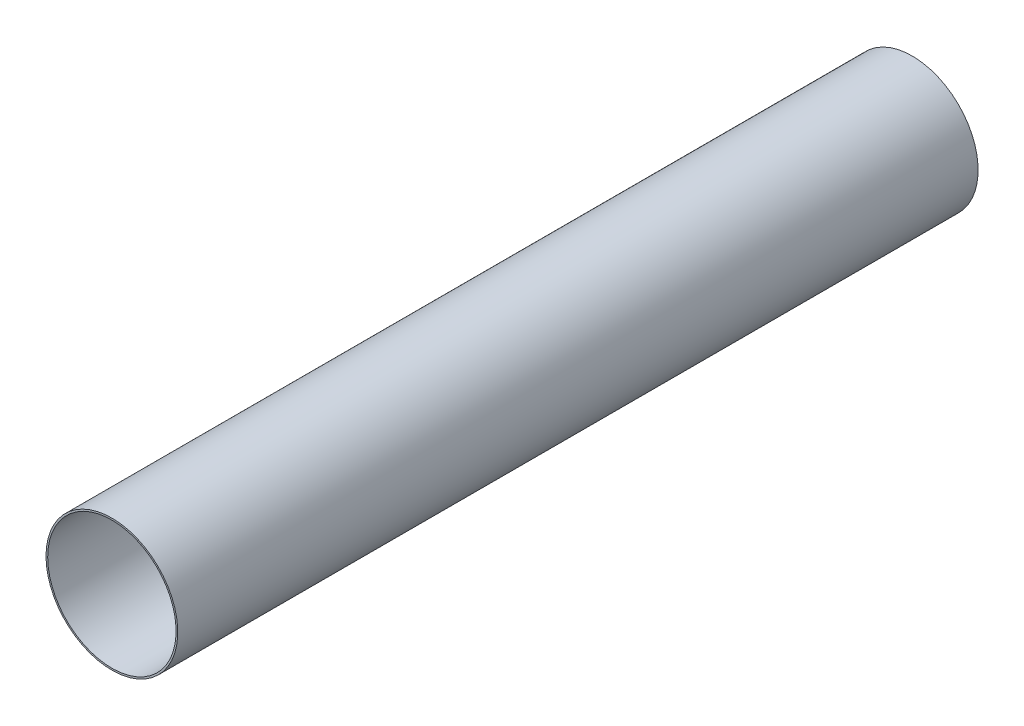
ISO-10303-21;
HEADER;
FILE_DESCRIPTION(('STEP AP214'),'2;1');
FILE_NAME('part.step','',(''),(''),'','','');
FILE_SCHEMA(('AUTOMOTIVE_DESIGN { 1 0 10303 214 1 1 1 1 }'));
ENDSEC;
DATA;
#1=APPLICATION_CONTEXT('core data for automotive mechanical design processes');
#2=APPLICATION_PROTOCOL_DEFINITION('international standard','automotive_design',2000,#1);
#3=PRODUCT_CONTEXT('',#1,'mechanical');
#4=PRODUCT('Part','Part','',(#3));
#5=PRODUCT_RELATED_PRODUCT_CATEGORY('part','',(#4));
#6=PRODUCT_DEFINITION_FORMATION('','',#4);
#7=PRODUCT_DEFINITION_CONTEXT('part definition',#1,'design');
#8=PRODUCT_DEFINITION('design','',#6,#7);
#9=PRODUCT_DEFINITION_SHAPE('','',#8);
#10=(LENGTH_UNIT() NAMED_UNIT(*) SI_UNIT(.MILLI.,.METRE.));
#11=(NAMED_UNIT(*) PLANE_ANGLE_UNIT() SI_UNIT($,.RADIAN.));
#12=(NAMED_UNIT(*) SI_UNIT($,.STERADIAN.) SOLID_ANGLE_UNIT());
#13=UNCERTAINTY_MEASURE_WITH_UNIT(LENGTH_MEASURE(1.E-05),#10,'distance_accuracy_value','');
#14=(GEOMETRIC_REPRESENTATION_CONTEXT(3) GLOBAL_UNCERTAINTY_ASSIGNED_CONTEXT((#13)) GLOBAL_UNIT_ASSIGNED_CONTEXT((#10,
#11,#12)) REPRESENTATION_CONTEXT('',''));
#15=CARTESIAN_POINT('',(0.,0.,0.));
#16=DIRECTION('',(0.,0.,1.));
#17=DIRECTION('',(1.,0.,0.));
#18=AXIS2_PLACEMENT_3D('',#15,#16,#17);
#19=CARTESIAN_POINT('',(0.,0.,950.));
#20=DIRECTION('',(0.,0.,1.));
#21=DIRECTION('',(1.,0.,0.));
#22=AXIS2_PLACEMENT_3D('',#19,#20,#21);
#23=PLANE('',#22);
#24=CARTESIAN_POINT('',(0.,0.,950.));
#25=DIRECTION('',(0.,0.,1.));
#26=DIRECTION('',(1.,0.,0.));
#27=AXIS2_PLACEMENT_3D('',#24,#25,#26);
#28=CIRCLE('',#27,78.2);
#29=CARTESIAN_POINT('',(-78.2,0.,950.));
#30=VERTEX_POINT('',#29);
#31=EDGE_CURVE('E10',#30,#30,#28,.T.);
#32=ORIENTED_EDGE('',*,*,#31,.T.);
#33=EDGE_LOOP('',(#32));
#34=FACE_BOUND('',#33,.T.);
#35=CARTESIAN_POINT('',(0.,0.,950.));
#36=DIRECTION('',(0.,0.,1.));
#37=DIRECTION('',(1.,0.,0.));
#38=AXIS2_PLACEMENT_3D('',#35,#36,#37);
#39=CIRCLE('',#38,76.2);
#40=CARTESIAN_POINT('',(-76.2,0.,950.));
#41=VERTEX_POINT('',#40);
#42=EDGE_CURVE('E50',#41,#41,#39,.T.);
#43=ORIENTED_EDGE('',*,*,#42,.F.);
#44=EDGE_LOOP('',(#43));
#45=FACE_BOUND('',#44,.T.);
#46=ADVANCED_FACE('F37',(#34,#45),#23,.T.);
#47=CARTESIAN_POINT('',(0.,0.,0.));
#48=DIRECTION('',(0.,0.,1.));
#49=DIRECTION('',(1.,0.,0.));
#50=AXIS2_PLACEMENT_3D('',#47,#48,#49);
#51=PLANE('',#50);
#52=CARTESIAN_POINT('',(0.,0.,0.));
#53=DIRECTION('',(0.,0.,1.));
#54=DIRECTION('',(1.,0.,0.));
#55=AXIS2_PLACEMENT_3D('',#52,#53,#54);
#56=CIRCLE('',#55,78.2);
#57=CARTESIAN_POINT('',(-78.2,0.,-1.11022302462516E-13));
#58=VERTEX_POINT('',#57);
#59=EDGE_CURVE('E41',#58,#58,#56,.T.);
#60=ORIENTED_EDGE('',*,*,#59,.F.);
#61=EDGE_LOOP('',(#60));
#62=FACE_BOUND('',#61,.T.);
#63=CARTESIAN_POINT('',(0.,0.,0.));
#64=DIRECTION('',(0.,0.,1.));
#65=DIRECTION('',(1.,0.,0.));
#66=AXIS2_PLACEMENT_3D('',#63,#64,#65);
#67=CIRCLE('',#66,76.2);
#68=CARTESIAN_POINT('',(-76.2,0.,-1.11022302462516E-13));
#69=VERTEX_POINT('',#68);
#70=EDGE_CURVE('E52',#69,#69,#67,.T.);
#71=ORIENTED_EDGE('',*,*,#70,.T.);
#72=EDGE_LOOP('',(#71));
#73=FACE_BOUND('',#72,.T.);
#74=ADVANCED_FACE('F64',(#62,#73),#51,.F.);
#75=CARTESIAN_POINT('',(0.,0.,950.));
#76=DIRECTION('',(0.,0.,-1.));
#77=DIRECTION('',(-1.,0.,0.));
#78=AXIS2_PLACEMENT_3D('',#75,#76,#77);
#79=CYLINDRICAL_SURFACE('',#78,78.2);
#80=CARTESIAN_POINT('',(-78.2,0.,950.));
#81=CARTESIAN_POINT('',(-78.2,0.,940.104166666667));
#82=CARTESIAN_POINT('',(-78.2,0.,930.208333333333));
#83=CARTESIAN_POINT('',(-78.2,0.,910.416666666667));
#84=CARTESIAN_POINT('',(-78.2,0.,900.520833333333));
#85=CARTESIAN_POINT('',(-78.2,0.,880.729166666667));
#86=CARTESIAN_POINT('',(-78.2,0.,870.833333333333));
#87=CARTESIAN_POINT('',(-78.2,0.,851.041666666667));
#88=CARTESIAN_POINT('',(-78.2,0.,841.145833333333));
#89=CARTESIAN_POINT('',(-78.2,0.,821.354166666667));
#90=CARTESIAN_POINT('',(-78.2,0.,811.458333333333));
#91=CARTESIAN_POINT('',(-78.2,0.,791.666666666667));
#92=CARTESIAN_POINT('',(-78.2,0.,781.770833333333));
#93=CARTESIAN_POINT('',(-78.2,0.,761.979166666667));
#94=CARTESIAN_POINT('',(-78.2,0.,752.083333333333));
#95=CARTESIAN_POINT('',(-78.2,0.,732.291666666667));
#96=CARTESIAN_POINT('',(-78.2,0.,722.395833333333));
#97=CARTESIAN_POINT('',(-78.2,0.,702.604166666667));
#98=CARTESIAN_POINT('',(-78.2,0.,692.708333333333));
#99=CARTESIAN_POINT('',(-78.2,0.,672.916666666667));
#100=CARTESIAN_POINT('',(-78.2,0.,663.020833333333));
#101=CARTESIAN_POINT('',(-78.2,0.,643.229166666667));
#102=CARTESIAN_POINT('',(-78.2,0.,633.333333333333));
#103=CARTESIAN_POINT('',(-78.2,0.,613.541666666667));
#104=CARTESIAN_POINT('',(-78.2,0.,603.645833333333));
#105=CARTESIAN_POINT('',(-78.2,0.,583.854166666667));
#106=CARTESIAN_POINT('',(-78.2,0.,573.958333333333));
#107=CARTESIAN_POINT('',(-78.2,0.,554.166666666667));
#108=CARTESIAN_POINT('',(-78.2,0.,544.270833333333));
#109=CARTESIAN_POINT('',(-78.2,0.,524.479166666667));
#110=CARTESIAN_POINT('',(-78.2,0.,514.583333333333));
#111=CARTESIAN_POINT('',(-78.2,0.,494.791666666667));
#112=CARTESIAN_POINT('',(-78.2,0.,484.895833333333));
#113=CARTESIAN_POINT('',(-78.2,0.,465.104166666667));
#114=CARTESIAN_POINT('',(-78.2,0.,455.208333333333));
#115=CARTESIAN_POINT('',(-78.2,0.,435.416666666667));
#116=CARTESIAN_POINT('',(-78.2,0.,425.520833333333));
#117=CARTESIAN_POINT('',(-78.2,0.,405.729166666667));
#118=CARTESIAN_POINT('',(-78.2,0.,395.833333333333));
#119=CARTESIAN_POINT('',(-78.2,0.,376.041666666667));
#120=CARTESIAN_POINT('',(-78.2,0.,366.145833333333));
#121=CARTESIAN_POINT('',(-78.2,0.,346.354166666667));
#122=CARTESIAN_POINT('',(-78.2,0.,336.458333333333));
#123=CARTESIAN_POINT('',(-78.2,0.,316.666666666667));
#124=CARTESIAN_POINT('',(-78.2,0.,306.770833333333));
#125=CARTESIAN_POINT('',(-78.2,0.,286.979166666667));
#126=CARTESIAN_POINT('',(-78.2,0.,277.083333333333));
#127=CARTESIAN_POINT('',(-78.2,0.,257.291666666667));
#128=CARTESIAN_POINT('',(-78.2,0.,247.395833333333));
#129=CARTESIAN_POINT('',(-78.2,0.,227.604166666667));
#130=CARTESIAN_POINT('',(-78.2,0.,217.708333333333));
#131=CARTESIAN_POINT('',(-78.2,0.,197.916666666667));
#132=CARTESIAN_POINT('',(-78.2,0.,188.020833333333));
#133=CARTESIAN_POINT('',(-78.2,0.,168.229166666667));
#134=CARTESIAN_POINT('',(-78.2,0.,158.333333333333));
#135=CARTESIAN_POINT('',(-78.2,0.,138.541666666667));
#136=CARTESIAN_POINT('',(-78.2,0.,128.645833333333));
#137=CARTESIAN_POINT('',(-78.2,0.,108.854166666667));
#138=CARTESIAN_POINT('',(-78.2,0.,98.9583333333333));
#139=CARTESIAN_POINT('',(-78.2,0.,79.1666666666666));
#140=CARTESIAN_POINT('',(-78.2,0.,69.2708333333332));
#141=CARTESIAN_POINT('',(-78.2,0.,49.4791666666665));
#142=CARTESIAN_POINT('',(-78.2,0.,39.5833333333332));
#143=CARTESIAN_POINT('',(-78.2,0.,19.7916666666665));
#144=CARTESIAN_POINT('',(-78.2,0.,9.89583333333321));
#145=CARTESIAN_POINT('',(-78.2,0.,-1.11022302462516E-13));
#146=B_SPLINE_CURVE_WITH_KNOTS('',3,(#80,#81,#82,#83,#84,#85,#86,#87,#88,#89,#90,#91,#92,#93,
#94,#95,#96,#97,#98,#99,#100,#101,#102,#103,#104,#105,#106,#107,#108,#109,#110,#111,#112,#113,
#114,#115,#116,#117,#118,#119,#120,#121,#122,#123,#124,#125,#126,#127,#128,#129,#130,#131,#132,
#133,#134,#135,#136,#137,#138,#139,#140,#141,#142,#143,#144,#145),.UNSPECIFIED.,.F.,.F.,(4,2,2,
2,2,2,2,2,2,2,2,2,2,2,2,2,2,2,2,2,2,2,2,2,2,2,2,2,2,2,2,2,4),(0.,29.6875000000001,
59.3750000000001,89.0625,118.75,148.4375,178.125,207.8125,237.5,267.1875,296.875,326.5625,
356.25,385.9375,415.625,445.3125,475.,504.6875,534.375,564.0625,593.75,623.4375,653.125,
682.8125,712.5,742.1875,771.875,801.5625,831.25,860.9375,890.625,920.3125,950.),.UNSPECIFIED.);
#147=EDGE_CURVE('BSEAM39',#30,#58,#146,.T.);
#148=ORIENTED_EDGE('',*,*,#31,.F.);
#149=ORIENTED_EDGE('',*,*,#59,.T.);
#150=ORIENTED_EDGE('',*,*,#147,.T.);
#151=ORIENTED_EDGE('',*,*,#147,.F.);
#152=EDGE_LOOP('',(#148,#150,#149,#151));
#153=FACE_BOUND('',#152,.T.);
#154=ADVANCED_FACE('F39',(#153),#79,.T.);
#155=CARTESIAN_POINT('',(0.,0.,950.));
#156=DIRECTION('',(0.,0.,-1.));
#157=DIRECTION('',(-1.,0.,0.));
#158=AXIS2_PLACEMENT_3D('',#155,#156,#157);
#159=CYLINDRICAL_SURFACE('',#158,76.2);
#160=CARTESIAN_POINT('',(-76.2,0.,950.));
#161=CARTESIAN_POINT('',(-76.2,0.,940.104166666667));
#162=CARTESIAN_POINT('',(-76.2,0.,930.208333333333));
#163=CARTESIAN_POINT('',(-76.2,0.,910.416666666667));
#164=CARTESIAN_POINT('',(-76.2,0.,900.520833333333));
#165=CARTESIAN_POINT('',(-76.2,0.,880.729166666667));
#166=CARTESIAN_POINT('',(-76.2,0.,870.833333333333));
#167=CARTESIAN_POINT('',(-76.2,0.,851.041666666667));
#168=CARTESIAN_POINT('',(-76.2,0.,841.145833333333));
#169=CARTESIAN_POINT('',(-76.2,0.,821.354166666667));
#170=CARTESIAN_POINT('',(-76.2,0.,811.458333333333));
#171=CARTESIAN_POINT('',(-76.2,0.,791.666666666667));
#172=CARTESIAN_POINT('',(-76.2,0.,781.770833333333));
#173=CARTESIAN_POINT('',(-76.2,0.,761.979166666667));
#174=CARTESIAN_POINT('',(-76.2,0.,752.083333333333));
#175=CARTESIAN_POINT('',(-76.2,0.,732.291666666667));
#176=CARTESIAN_POINT('',(-76.2,0.,722.395833333333));
#177=CARTESIAN_POINT('',(-76.2,0.,702.604166666667));
#178=CARTESIAN_POINT('',(-76.2,0.,692.708333333333));
#179=CARTESIAN_POINT('',(-76.2,0.,672.916666666667));
#180=CARTESIAN_POINT('',(-76.2,0.,663.020833333333));
#181=CARTESIAN_POINT('',(-76.2,0.,643.229166666667));
#182=CARTESIAN_POINT('',(-76.2,0.,633.333333333333));
#183=CARTESIAN_POINT('',(-76.2,0.,613.541666666667));
#184=CARTESIAN_POINT('',(-76.2,0.,603.645833333333));
#185=CARTESIAN_POINT('',(-76.2,0.,583.854166666667));
#186=CARTESIAN_POINT('',(-76.2,0.,573.958333333333));
#187=CARTESIAN_POINT('',(-76.2,0.,554.166666666667));
#188=CARTESIAN_POINT('',(-76.2,0.,544.270833333333));
#189=CARTESIAN_POINT('',(-76.2,0.,524.479166666667));
#190=CARTESIAN_POINT('',(-76.2,0.,514.583333333333));
#191=CARTESIAN_POINT('',(-76.2,0.,494.791666666667));
#192=CARTESIAN_POINT('',(-76.2,0.,484.895833333333));
#193=CARTESIAN_POINT('',(-76.2,0.,465.104166666667));
#194=CARTESIAN_POINT('',(-76.2,0.,455.208333333333));
#195=CARTESIAN_POINT('',(-76.2,0.,435.416666666667));
#196=CARTESIAN_POINT('',(-76.2,0.,425.520833333333));
#197=CARTESIAN_POINT('',(-76.2,0.,405.729166666667));
#198=CARTESIAN_POINT('',(-76.2,0.,395.833333333333));
#199=CARTESIAN_POINT('',(-76.2,0.,376.041666666667));
#200=CARTESIAN_POINT('',(-76.2,0.,366.145833333333));
#201=CARTESIAN_POINT('',(-76.2,0.,346.354166666667));
#202=CARTESIAN_POINT('',(-76.2,0.,336.458333333333));
#203=CARTESIAN_POINT('',(-76.2,0.,316.666666666667));
#204=CARTESIAN_POINT('',(-76.2,0.,306.770833333333));
#205=CARTESIAN_POINT('',(-76.2,0.,286.979166666667));
#206=CARTESIAN_POINT('',(-76.2,0.,277.083333333333));
#207=CARTESIAN_POINT('',(-76.2,0.,257.291666666667));
#208=CARTESIAN_POINT('',(-76.2,0.,247.395833333333));
#209=CARTESIAN_POINT('',(-76.2,0.,227.604166666667));
#210=CARTESIAN_POINT('',(-76.2,0.,217.708333333333));
#211=CARTESIAN_POINT('',(-76.2,0.,197.916666666667));
#212=CARTESIAN_POINT('',(-76.2,0.,188.020833333333));
#213=CARTESIAN_POINT('',(-76.2,0.,168.229166666667));
#214=CARTESIAN_POINT('',(-76.2,0.,158.333333333333));
#215=CARTESIAN_POINT('',(-76.2,0.,138.541666666667));
#216=CARTESIAN_POINT('',(-76.2,0.,128.645833333333));
#217=CARTESIAN_POINT('',(-76.2,0.,108.854166666667));
#218=CARTESIAN_POINT('',(-76.2,0.,98.9583333333333));
#219=CARTESIAN_POINT('',(-76.2,0.,79.1666666666666));
#220=CARTESIAN_POINT('',(-76.2,0.,69.2708333333332));
#221=CARTESIAN_POINT('',(-76.2,0.,49.4791666666665));
#222=CARTESIAN_POINT('',(-76.2,0.,39.5833333333332));
#223=CARTESIAN_POINT('',(-76.2,0.,19.7916666666665));
#224=CARTESIAN_POINT('',(-76.2,0.,9.89583333333321));
#225=CARTESIAN_POINT('',(-76.2,0.,-1.11022302462516E-13));
#226=B_SPLINE_CURVE_WITH_KNOTS('',3,(#160,#161,#162,#163,#164,#165,#166,#167,#168,#169,#170,
#171,#172,#173,#174,#175,#176,#177,#178,#179,#180,#181,#182,#183,#184,#185,#186,#187,#188,#189,
#190,#191,#192,#193,#194,#195,#196,#197,#198,#199,#200,#201,#202,#203,#204,#205,#206,#207,#208,
#209,#210,#211,#212,#213,#214,#215,#216,#217,#218,#219,#220,#221,#222,#223,#224,#225),
.UNSPECIFIED.,.F.,.F.,(4,2,2,2,2,2,2,2,2,2,2,2,2,2,2,2,2,2,2,2,2,2,2,2,2,2,2,2,2,2,2,2,4),(0.,
29.6875,59.375,89.0624999999999,118.75,148.4375,178.125,207.8125,237.5,267.1875,296.875,
326.5625,356.25,385.9375,415.625,445.3125,475.,504.6875,534.375,564.0625,593.75,623.4375,
653.125,682.8125,712.5,742.1875,771.875,801.5625,831.25,860.9375,890.625,920.3125,950.),.UNSPECIFIED.);
#227=EDGE_CURVE('BSEAM60',#41,#69,#226,.T.);
#228=ORIENTED_EDGE('',*,*,#42,.T.);
#229=ORIENTED_EDGE('',*,*,#70,.F.);
#230=ORIENTED_EDGE('',*,*,#227,.T.);
#231=ORIENTED_EDGE('',*,*,#227,.F.);
#232=EDGE_LOOP('',(#228,#230,#229,#231));
#233=FACE_BOUND('',#232,.T.);
#234=ADVANCED_FACE('F60',(#233),#159,.F.);
#235=CLOSED_SHELL('',(#46,#74,#154,#234));
#236=MANIFOLD_SOLID_BREP('B2',#235);
#237=ADVANCED_BREP_SHAPE_REPRESENTATION('',(#18,#236),#14);
#238=SHAPE_DEFINITION_REPRESENTATION(#9,#237);
ENDSEC;
END-ISO-10303-21;
